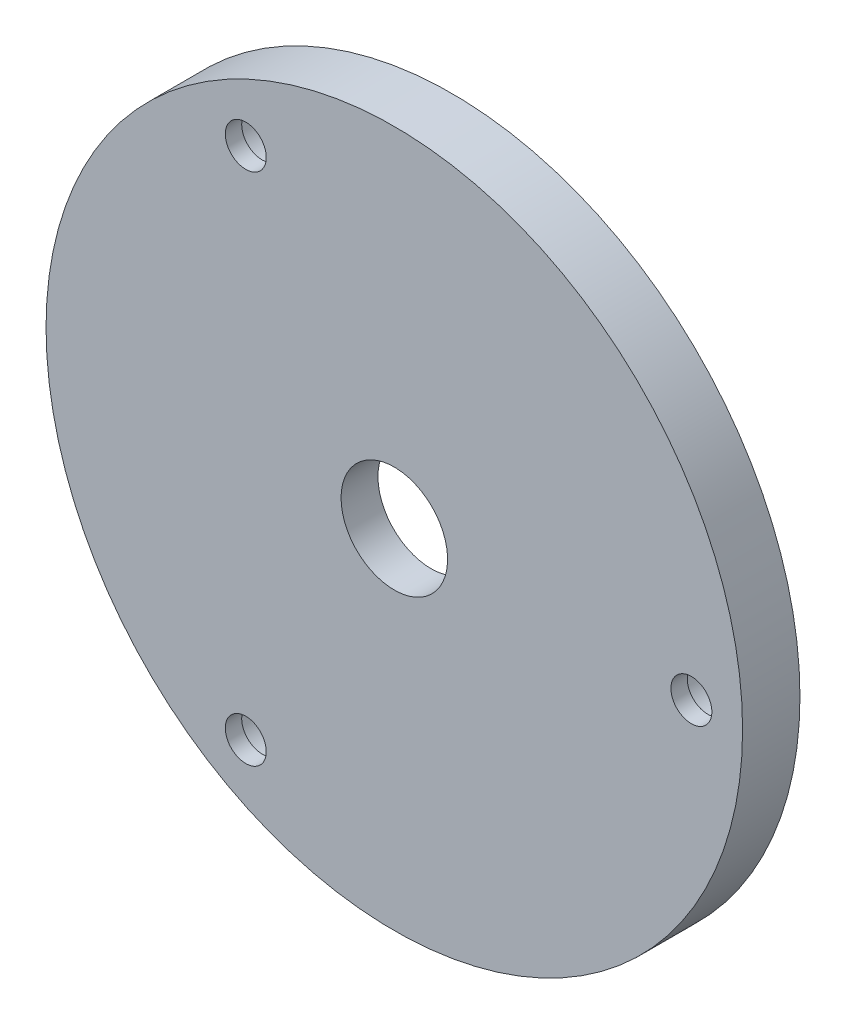
ISO-10303-21;
HEADER;
FILE_DESCRIPTION(('STEP AP214'),'2;1');
FILE_NAME('part.step','',(''),(''),'','','');
FILE_SCHEMA(('AUTOMOTIVE_DESIGN { 1 0 10303 214 1 1 1 1 }'));
ENDSEC;
DATA;
#1=APPLICATION_CONTEXT('core data for automotive mechanical design processes');
#2=APPLICATION_PROTOCOL_DEFINITION('international standard','automotive_design',2000,#1);
#3=PRODUCT_CONTEXT('',#1,'mechanical');
#4=PRODUCT('Part','Part','',(#3));
#5=PRODUCT_RELATED_PRODUCT_CATEGORY('part','',(#4));
#6=PRODUCT_DEFINITION_FORMATION('','',#4);
#7=PRODUCT_DEFINITION_CONTEXT('part definition',#1,'design');
#8=PRODUCT_DEFINITION('design','',#6,#7);
#9=PRODUCT_DEFINITION_SHAPE('','',#8);
#10=(LENGTH_UNIT() NAMED_UNIT(*) SI_UNIT(.MILLI.,.METRE.));
#11=(NAMED_UNIT(*) PLANE_ANGLE_UNIT() SI_UNIT($,.RADIAN.));
#12=(NAMED_UNIT(*) SI_UNIT($,.STERADIAN.) SOLID_ANGLE_UNIT());
#13=UNCERTAINTY_MEASURE_WITH_UNIT(LENGTH_MEASURE(1.E-05),#10,'distance_accuracy_value','');
#14=(GEOMETRIC_REPRESENTATION_CONTEXT(3) GLOBAL_UNCERTAINTY_ASSIGNED_CONTEXT((#13)) GLOBAL_UNIT_ASSIGNED_CONTEXT((#10,
#11,#12)) REPRESENTATION_CONTEXT('',''));
#15=CARTESIAN_POINT('',(0.,0.,0.));
#16=DIRECTION('',(0.,0.,1.));
#17=DIRECTION('',(1.,0.,0.));
#18=AXIS2_PLACEMENT_3D('',#15,#16,#17);
#19=CARTESIAN_POINT('',(0.,0.,0.));
#20=DIRECTION('',(0.,0.,1.));
#21=DIRECTION('',(1.,0.,0.));
#22=AXIS2_PLACEMENT_3D('',#19,#20,#21);
#23=CYLINDRICAL_SURFACE('',#22,85.);
#24=CARTESIAN_POINT('',(0.,0.,0.));
#25=DIRECTION('',(0.,0.,1.));
#26=DIRECTION('',(1.,0.,0.));
#27=AXIS2_PLACEMENT_3D('',#24,#25,#26);
#28=CIRCLE('',#27,85.);
#29=CARTESIAN_POINT('',(85.,0.,0.));
#30=VERTEX_POINT('',#29);
#31=EDGE_CURVE('E10',#30,#30,#28,.T.);
#32=ORIENTED_EDGE('',*,*,#31,.T.);
#33=EDGE_LOOP('',(#32));
#34=FACE_BOUND('',#33,.T.);
#35=CARTESIAN_POINT('',(0.,0.,14.));
#36=DIRECTION('',(0.,0.,1.));
#37=DIRECTION('',(1.,0.,0.));
#38=AXIS2_PLACEMENT_3D('',#35,#36,#37);
#39=CIRCLE('',#38,85.);
#40=CARTESIAN_POINT('',(85.,0.,14.));
#41=VERTEX_POINT('',#40);
#42=EDGE_CURVE('E40',#41,#41,#39,.T.);
#43=ORIENTED_EDGE('',*,*,#42,.F.);
#44=EDGE_LOOP('',(#43));
#45=FACE_BOUND('',#44,.T.);
#46=ADVANCED_FACE('F34',(#34,#45),#23,.T.);
#47=CARTESIAN_POINT('',(85.,0.,0.));
#48=DIRECTION('',(0.,0.,-1.));
#49=DIRECTION('',(-1.,0.,0.));
#50=AXIS2_PLACEMENT_3D('',#47,#48,#49);
#51=PLANE('',#50);
#52=CARTESIAN_POINT('',(-36.2499999999998,62.7868417743719,0.));
#53=DIRECTION('',(0.,0.,-1.));
#54=DIRECTION('',(-1.,0.,0.));
#55=AXIS2_PLACEMENT_3D('',#52,#53,#54);
#56=CIRCLE('',#55,7.99999999999998);
#57=CARTESIAN_POINT('',(-44.2499999999998,62.7868417743719,0.));
#58=VERTEX_POINT('',#57);
#59=EDGE_CURVE('E92',#58,#58,#56,.T.);
#60=ORIENTED_EDGE('',*,*,#59,.F.);
#61=EDGE_LOOP('',(#60));
#62=FACE_BOUND('',#61,.T.);
#63=CARTESIAN_POINT('',(72.5,0.,0.));
#64=DIRECTION('',(0.,0.,-1.));
#65=DIRECTION('',(-1.,0.,0.));
#66=AXIS2_PLACEMENT_3D('',#63,#64,#65);
#67=CIRCLE('',#66,7.99999999999998);
#68=CARTESIAN_POINT('',(64.5,0.,0.));
#69=VERTEX_POINT('',#68);
#70=EDGE_CURVE('E80',#69,#69,#67,.T.);
#71=ORIENTED_EDGE('',*,*,#70,.F.);
#72=EDGE_LOOP('',(#71));
#73=FACE_BOUND('',#72,.T.);
#74=CARTESIAN_POINT('',(-36.2499999999999,-62.7868417743719,0.));
#75=DIRECTION('',(0.,0.,-1.));
#76=DIRECTION('',(-1.,0.,0.));
#77=AXIS2_PLACEMENT_3D('',#74,#75,#76);
#78=CIRCLE('',#77,7.99999999999998);
#79=CARTESIAN_POINT('',(-44.2499999999998,-62.7868417743719,0.));
#80=VERTEX_POINT('',#79);
#81=EDGE_CURVE('E68',#80,#80,#78,.T.);
#82=ORIENTED_EDGE('',*,*,#81,.F.);
#83=EDGE_LOOP('',(#82));
#84=FACE_BOUND('',#83,.T.);
#85=CARTESIAN_POINT('',(0.,0.,0.));
#86=DIRECTION('',(0.,0.,-1.));
#87=DIRECTION('',(-1.,0.,0.));
#88=AXIS2_PLACEMENT_3D('',#85,#86,#87);
#89=CIRCLE('',#88,60.);
#90=CARTESIAN_POINT('',(-60.,0.,0.));
#91=VERTEX_POINT('',#90);
#92=EDGE_CURVE('E56',#91,#91,#89,.T.);
#93=ORIENTED_EDGE('',*,*,#92,.F.);
#94=EDGE_LOOP('',(#93));
#95=FACE_BOUND('',#94,.T.);
#96=ORIENTED_EDGE('',*,*,#31,.F.);
#97=EDGE_LOOP('',(#96));
#98=FACE_BOUND('',#97,.T.);
#99=ADVANCED_FACE('F98',(#62,#73,#84,#95,#98),#51,.T.);
#100=CARTESIAN_POINT('',(0.,0.,14.));
#101=DIRECTION('',(0.,0.,1.));
#102=DIRECTION('',(1.,0.,0.));
#103=AXIS2_PLACEMENT_3D('',#100,#101,#102);
#104=PLANE('',#103);
#105=CARTESIAN_POINT('',(-36.2499999999998,62.7868417743719,14.));
#106=DIRECTION('',(0.,0.,-1.));
#107=DIRECTION('',(-1.,0.,0.));
#108=AXIS2_PLACEMENT_3D('',#105,#106,#107);
#109=CIRCLE('',#108,5.);
#110=CARTESIAN_POINT('',(-41.2499999999998,62.7868417743719,14.));
#111=VERTEX_POINT('',#110);
#112=EDGE_CURVE('E83',#111,#111,#109,.T.);
#113=ORIENTED_EDGE('',*,*,#112,.T.);
#114=EDGE_LOOP('',(#113));
#115=FACE_BOUND('',#114,.T.);
#116=CARTESIAN_POINT('',(72.5,0.,14.));
#117=DIRECTION('',(0.,0.,-1.));
#118=DIRECTION('',(-1.,0.,0.));
#119=AXIS2_PLACEMENT_3D('',#116,#117,#118);
#120=CIRCLE('',#119,5.);
#121=CARTESIAN_POINT('',(67.5,0.,14.));
#122=VERTEX_POINT('',#121);
#123=EDGE_CURVE('E71',#122,#122,#120,.T.);
#124=ORIENTED_EDGE('',*,*,#123,.T.);
#125=EDGE_LOOP('',(#124));
#126=FACE_BOUND('',#125,.T.);
#127=CARTESIAN_POINT('',(-36.2499999999999,-62.7868417743719,14.));
#128=DIRECTION('',(0.,0.,-1.));
#129=DIRECTION('',(-1.,0.,0.));
#130=AXIS2_PLACEMENT_3D('',#127,#128,#129);
#131=CIRCLE('',#130,5.);
#132=CARTESIAN_POINT('',(-41.2499999999999,-62.7868417743719,14.));
#133=VERTEX_POINT('',#132);
#134=EDGE_CURVE('E59',#133,#133,#131,.T.);
#135=ORIENTED_EDGE('',*,*,#134,.T.);
#136=EDGE_LOOP('',(#135));
#137=FACE_BOUND('',#136,.T.);
#138=CARTESIAN_POINT('',(0.,0.,14.));
#139=DIRECTION('',(0.,0.,-1.));
#140=DIRECTION('',(-1.,0.,0.));
#141=AXIS2_PLACEMENT_3D('',#138,#139,#140);
#142=CIRCLE('',#141,13.);
#143=CARTESIAN_POINT('',(-13.,0.,14.));
#144=VERTEX_POINT('',#143);
#145=EDGE_CURVE('E44',#144,#144,#142,.T.);
#146=ORIENTED_EDGE('',*,*,#145,.T.);
#147=EDGE_LOOP('',(#146));
#148=FACE_BOUND('',#147,.T.);
#149=ORIENTED_EDGE('',*,*,#42,.T.);
#150=EDGE_LOOP('',(#149));
#151=FACE_BOUND('',#150,.T.);
#152=ADVANCED_FACE('F101',(#115,#126,#137,#148,#151),#104,.T.);
#153=CARTESIAN_POINT('',(0.,0.,0.));
#154=DIRECTION('',(0.,0.,-1.));
#155=DIRECTION('',(-1.,0.,0.));
#156=AXIS2_PLACEMENT_3D('',#153,#154,#155);
#157=CYLINDRICAL_SURFACE('',#156,13.);
#158=ORIENTED_EDGE('',*,*,#145,.F.);
#159=EDGE_LOOP('',(#158));
#160=FACE_BOUND('',#159,.T.);
#161=CARTESIAN_POINT('',(0.,0.,5.));
#162=DIRECTION('',(0.,0.,-1.));
#163=DIRECTION('',(-1.,0.,0.));
#164=AXIS2_PLACEMENT_3D('',#161,#162,#163);
#165=CIRCLE('',#164,13.);
#166=CARTESIAN_POINT('',(-13.,0.,5.));
#167=VERTEX_POINT('',#166);
#168=EDGE_CURVE('E48',#167,#167,#165,.T.);
#169=ORIENTED_EDGE('',*,*,#168,.T.);
#170=EDGE_LOOP('',(#169));
#171=FACE_BOUND('',#170,.T.);
#172=ADVANCED_FACE('F122',(#160,#171),#157,.F.);
#173=CARTESIAN_POINT('',(13.,0.,5.));
#174=DIRECTION('',(0.,0.,1.));
#175=DIRECTION('',(1.,0.,0.));
#176=AXIS2_PLACEMENT_3D('',#173,#174,#175);
#177=PLANE('',#176);
#178=ORIENTED_EDGE('',*,*,#168,.F.);
#179=EDGE_LOOP('',(#178));
#180=FACE_BOUND('',#179,.T.);
#181=CARTESIAN_POINT('',(0.,0.,5.));
#182=DIRECTION('',(0.,0.,-1.));
#183=DIRECTION('',(-1.,0.,0.));
#184=AXIS2_PLACEMENT_3D('',#181,#182,#183);
#185=CIRCLE('',#184,60.);
#186=CARTESIAN_POINT('',(-60.,0.,5.));
#187=VERTEX_POINT('',#186);
#188=EDGE_CURVE('E53',#187,#187,#185,.T.);
#189=ORIENTED_EDGE('',*,*,#188,.T.);
#190=EDGE_LOOP('',(#189));
#191=FACE_BOUND('',#190,.T.);
#192=ADVANCED_FACE('F112',(#180,#191),#177,.F.);
#193=CARTESIAN_POINT('',(0.,0.,0.));
#194=DIRECTION('',(0.,0.,-1.));
#195=DIRECTION('',(-1.,0.,0.));
#196=AXIS2_PLACEMENT_3D('',#193,#194,#195);
#197=CYLINDRICAL_SURFACE('',#196,60.);
#198=ORIENTED_EDGE('',*,*,#188,.F.);
#199=EDGE_LOOP('',(#198));
#200=FACE_BOUND('',#199,.T.);
#201=ORIENTED_EDGE('',*,*,#92,.T.);
#202=EDGE_LOOP('',(#201));
#203=FACE_BOUND('',#202,.T.);
#204=ADVANCED_FACE('F109',(#200,#203),#197,.F.);
#205=CARTESIAN_POINT('',(-36.2499999999999,-62.7868417743719,0.));
#206=DIRECTION('',(0.,0.,-1.));
#207=DIRECTION('',(-1.,0.,0.));
#208=AXIS2_PLACEMENT_3D('',#205,#206,#207);
#209=CYLINDRICAL_SURFACE('',#208,5.);
#210=ORIENTED_EDGE('',*,*,#134,.F.);
#211=EDGE_LOOP('',(#210));
#212=FACE_BOUND('',#211,.T.);
#213=CARTESIAN_POINT('',(-36.2499999999999,-62.7868417743719,10.));
#214=DIRECTION('',(0.,0.,-1.));
#215=DIRECTION('',(-1.,0.,0.));
#216=AXIS2_PLACEMENT_3D('',#213,#214,#215);
#217=CIRCLE('',#216,5.);
#218=CARTESIAN_POINT('',(-41.2499999999999,-62.7868417743719,10.));
#219=VERTEX_POINT('',#218);
#220=EDGE_CURVE('E62',#219,#219,#217,.T.);
#221=ORIENTED_EDGE('',*,*,#220,.T.);
#222=EDGE_LOOP('',(#221));
#223=FACE_BOUND('',#222,.T.);
#224=ADVANCED_FACE('F111',(#212,#223),#209,.F.);
#225=CARTESIAN_POINT('',(-31.2499999999998,-62.7868417743719,10.));
#226=DIRECTION('',(0.,0.,1.));
#227=DIRECTION('',(1.,0.,0.));
#228=AXIS2_PLACEMENT_3D('',#225,#226,#227);
#229=PLANE('',#228);
#230=ORIENTED_EDGE('',*,*,#220,.F.);
#231=EDGE_LOOP('',(#230));
#232=FACE_BOUND('',#231,.T.);
#233=CARTESIAN_POINT('',(-36.2499999999999,-62.7868417743719,10.));
#234=DIRECTION('',(0.,0.,-1.));
#235=DIRECTION('',(-1.,0.,0.));
#236=AXIS2_PLACEMENT_3D('',#233,#234,#235);
#237=CIRCLE('',#236,7.99999999999998);
#238=CARTESIAN_POINT('',(-44.2499999999998,-62.7868417743719,10.));
#239=VERTEX_POINT('',#238);
#240=EDGE_CURVE('E65',#239,#239,#237,.T.);
#241=ORIENTED_EDGE('',*,*,#240,.T.);
#242=EDGE_LOOP('',(#241));
#243=FACE_BOUND('',#242,.T.);
#244=ADVANCED_FACE('F119',(#232,#243),#229,.F.);
#245=CARTESIAN_POINT('',(-36.2499999999999,-62.7868417743719,0.));
#246=DIRECTION('',(0.,0.,-1.));
#247=DIRECTION('',(-1.,0.,0.));
#248=AXIS2_PLACEMENT_3D('',#245,#246,#247);
#249=CYLINDRICAL_SURFACE('',#248,7.99999999999998);
#250=ORIENTED_EDGE('',*,*,#240,.F.);
#251=EDGE_LOOP('',(#250));
#252=FACE_BOUND('',#251,.T.);
#253=ORIENTED_EDGE('',*,*,#81,.T.);
#254=EDGE_LOOP('',(#253));
#255=FACE_BOUND('',#254,.T.);
#256=ADVANCED_FACE('F171',(#252,#255),#249,.F.);
#257=CARTESIAN_POINT('',(72.5,0.,0.));
#258=DIRECTION('',(0.,0.,-1.));
#259=DIRECTION('',(-1.,0.,0.));
#260=AXIS2_PLACEMENT_3D('',#257,#258,#259);
#261=CYLINDRICAL_SURFACE('',#260,5.);
#262=ORIENTED_EDGE('',*,*,#123,.F.);
#263=EDGE_LOOP('',(#262));
#264=FACE_BOUND('',#263,.T.);
#265=CARTESIAN_POINT('',(72.5,0.,10.));
#266=DIRECTION('',(0.,0.,-1.));
#267=DIRECTION('',(-1.,0.,0.));
#268=AXIS2_PLACEMENT_3D('',#265,#266,#267);
#269=CIRCLE('',#268,5.);
#270=CARTESIAN_POINT('',(67.5,0.,10.));
#271=VERTEX_POINT('',#270);
#272=EDGE_CURVE('E74',#271,#271,#269,.T.);
#273=ORIENTED_EDGE('',*,*,#272,.T.);
#274=EDGE_LOOP('',(#273));
#275=FACE_BOUND('',#274,.T.);
#276=ADVANCED_FACE('F180',(#264,#275),#261,.F.);
#277=CARTESIAN_POINT('',(77.5,0.,10.));
#278=DIRECTION('',(0.,0.,1.));
#279=DIRECTION('',(1.,0.,0.));
#280=AXIS2_PLACEMENT_3D('',#277,#278,#279);
#281=PLANE('',#280);
#282=ORIENTED_EDGE('',*,*,#272,.F.);
#283=EDGE_LOOP('',(#282));
#284=FACE_BOUND('',#283,.T.);
#285=CARTESIAN_POINT('',(72.5,0.,10.));
#286=DIRECTION('',(0.,0.,-1.));
#287=DIRECTION('',(-1.,0.,0.));
#288=AXIS2_PLACEMENT_3D('',#285,#286,#287);
#289=CIRCLE('',#288,7.99999999999998);
#290=CARTESIAN_POINT('',(64.5,0.,10.));
#291=VERTEX_POINT('',#290);
#292=EDGE_CURVE('E77',#291,#291,#289,.T.);
#293=ORIENTED_EDGE('',*,*,#292,.T.);
#294=EDGE_LOOP('',(#293));
#295=FACE_BOUND('',#294,.T.);
#296=ADVANCED_FACE('F189',(#284,#295),#281,.F.);
#297=CARTESIAN_POINT('',(72.5,0.,0.));
#298=DIRECTION('',(0.,0.,-1.));
#299=DIRECTION('',(-1.,0.,0.));
#300=AXIS2_PLACEMENT_3D('',#297,#298,#299);
#301=CYLINDRICAL_SURFACE('',#300,7.99999999999998);
#302=ORIENTED_EDGE('',*,*,#292,.F.);
#303=EDGE_LOOP('',(#302));
#304=FACE_BOUND('',#303,.T.);
#305=ORIENTED_EDGE('',*,*,#70,.T.);
#306=EDGE_LOOP('',(#305));
#307=FACE_BOUND('',#306,.T.);
#308=ADVANCED_FACE('F198',(#304,#307),#301,.F.);
#309=CARTESIAN_POINT('',(-36.2499999999998,62.7868417743719,0.));
#310=DIRECTION('',(0.,0.,-1.));
#311=DIRECTION('',(-1.,0.,0.));
#312=AXIS2_PLACEMENT_3D('',#309,#310,#311);
#313=CYLINDRICAL_SURFACE('',#312,5.);
#314=ORIENTED_EDGE('',*,*,#112,.F.);
#315=EDGE_LOOP('',(#314));
#316=FACE_BOUND('',#315,.T.);
#317=CARTESIAN_POINT('',(-36.2499999999998,62.7868417743719,10.));
#318=DIRECTION('',(0.,0.,-1.));
#319=DIRECTION('',(-1.,0.,0.));
#320=AXIS2_PLACEMENT_3D('',#317,#318,#319);
#321=CIRCLE('',#320,5.);
#322=CARTESIAN_POINT('',(-41.2499999999998,62.7868417743719,10.));
#323=VERTEX_POINT('',#322);
#324=EDGE_CURVE('E86',#323,#323,#321,.T.);
#325=ORIENTED_EDGE('',*,*,#324,.T.);
#326=EDGE_LOOP('',(#325));
#327=FACE_BOUND('',#326,.T.);
#328=ADVANCED_FACE('F207',(#316,#327),#313,.F.);
#329=CARTESIAN_POINT('',(-31.2499999999998,62.7868417743719,10.));
#330=DIRECTION('',(0.,0.,1.));
#331=DIRECTION('',(1.,0.,0.));
#332=AXIS2_PLACEMENT_3D('',#329,#330,#331);
#333=PLANE('',#332);
#334=ORIENTED_EDGE('',*,*,#324,.F.);
#335=EDGE_LOOP('',(#334));
#336=FACE_BOUND('',#335,.T.);
#337=CARTESIAN_POINT('',(-36.2499999999998,62.7868417743719,10.));
#338=DIRECTION('',(0.,0.,-1.));
#339=DIRECTION('',(-1.,0.,0.));
#340=AXIS2_PLACEMENT_3D('',#337,#338,#339);
#341=CIRCLE('',#340,7.99999999999998);
#342=CARTESIAN_POINT('',(-44.2499999999998,62.7868417743719,10.));
#343=VERTEX_POINT('',#342);
#344=EDGE_CURVE('E89',#343,#343,#341,.T.);
#345=ORIENTED_EDGE('',*,*,#344,.T.);
#346=EDGE_LOOP('',(#345));
#347=FACE_BOUND('',#346,.T.);
#348=ADVANCED_FACE('F216',(#336,#347),#333,.F.);
#349=CARTESIAN_POINT('',(-36.2499999999998,62.7868417743719,0.));
#350=DIRECTION('',(0.,0.,-1.));
#351=DIRECTION('',(-1.,0.,0.));
#352=AXIS2_PLACEMENT_3D('',#349,#350,#351);
#353=CYLINDRICAL_SURFACE('',#352,7.99999999999998);
#354=ORIENTED_EDGE('',*,*,#344,.F.);
#355=EDGE_LOOP('',(#354));
#356=FACE_BOUND('',#355,.T.);
#357=ORIENTED_EDGE('',*,*,#59,.T.);
#358=EDGE_LOOP('',(#357));
#359=FACE_BOUND('',#358,.T.);
#360=ADVANCED_FACE('F96',(#356,#359),#353,.F.);
#361=CLOSED_SHELL('',(#46,#99,#152,#172,#192,#204,#224,#244,#256,#276,#296,#308,#328,#348,#360));
#362=MANIFOLD_SOLID_BREP('B2',#361);
#363=ADVANCED_BREP_SHAPE_REPRESENTATION('',(#18,#362),#14);
#364=SHAPE_DEFINITION_REPRESENTATION(#9,#363);
ENDSEC;
END-ISO-10303-21;
